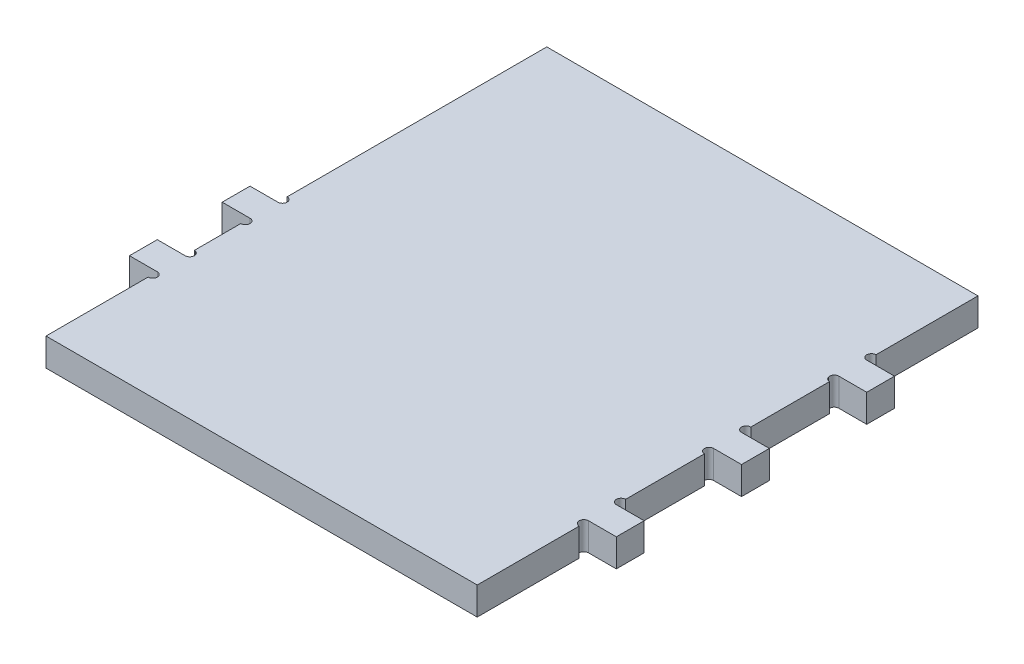
ISO-10303-21;
HEADER;
FILE_DESCRIPTION(('STEP AP214'),'2;1');
FILE_NAME('part.step','',(''),(''),'','','');
FILE_SCHEMA(('AUTOMOTIVE_DESIGN { 1 0 10303 214 1 1 1 1 }'));
ENDSEC;
DATA;
#1=APPLICATION_CONTEXT('core data for automotive mechanical design processes');
#2=APPLICATION_PROTOCOL_DEFINITION('international standard','automotive_design',2000,#1);
#3=PRODUCT_CONTEXT('',#1,'mechanical');
#4=PRODUCT('Part','Part','',(#3));
#5=PRODUCT_RELATED_PRODUCT_CATEGORY('part','',(#4));
#6=PRODUCT_DEFINITION_FORMATION('','',#4);
#7=PRODUCT_DEFINITION_CONTEXT('part definition',#1,'design');
#8=PRODUCT_DEFINITION('design','',#6,#7);
#9=PRODUCT_DEFINITION_SHAPE('','',#8);
#10=(LENGTH_UNIT() NAMED_UNIT(*) SI_UNIT(.MILLI.,.METRE.));
#11=(NAMED_UNIT(*) PLANE_ANGLE_UNIT() SI_UNIT($,.RADIAN.));
#12=(NAMED_UNIT(*) SI_UNIT($,.STERADIAN.) SOLID_ANGLE_UNIT());
#13=UNCERTAINTY_MEASURE_WITH_UNIT(LENGTH_MEASURE(1.E-05),#10,'distance_accuracy_value','');
#14=(GEOMETRIC_REPRESENTATION_CONTEXT(3) GLOBAL_UNCERTAINTY_ASSIGNED_CONTEXT((#13)) GLOBAL_UNIT_ASSIGNED_CONTEXT((#10,
#11,#12)) REPRESENTATION_CONTEXT('',''));
#15=CARTESIAN_POINT('',(0.,0.,0.));
#16=DIRECTION('',(0.,0.,1.));
#17=DIRECTION('',(1.,0.,0.));
#18=AXIS2_PLACEMENT_3D('',#15,#16,#17);
#19=CARTESIAN_POINT('',(0.,19.05,0.));
#20=DIRECTION('',(1.,0.,0.));
#21=DIRECTION('',(0.,0.,-1.));
#22=AXIS2_PLACEMENT_3D('',#19,#20,#21);
#23=PLANE('',#22);
#24=DIRECTION('',(0.,0.,1.));
#25=VECTOR('',#24,1.);
#26=CARTESIAN_POINT('',(0.,19.05,0.));
#27=LINE('',#26,#25);
#28=CARTESIAN_POINT('',(0.,19.05,-69.85));
#29=VERTEX_POINT('',#28);
#30=CARTESIAN_POINT('',(0.,19.05,0.));
#31=VERTEX_POINT('',#30);
#32=EDGE_CURVE('E451',#29,#31,#27,.T.);
#33=ORIENTED_EDGE('',*,*,#32,.F.);
#34=DIRECTION('',(0.,1.,0.));
#35=VECTOR('',#34,1.);
#36=CARTESIAN_POINT('',(0.,0.,-69.85));
#37=LINE('',#36,#35);
#38=CARTESIAN_POINT('',(0.,0.,-69.85));
#39=VERTEX_POINT('',#38);
#40=EDGE_CURVE('E585',#39,#29,#37,.T.);
#41=ORIENTED_EDGE('',*,*,#40,.F.);
#42=DIRECTION('',(0.,0.,1.));
#43=VECTOR('',#42,1.);
#44=CARTESIAN_POINT('',(0.,0.,0.));
#45=LINE('',#44,#43);
#46=CARTESIAN_POINT('',(0.,0.,0.));
#47=VERTEX_POINT('',#46);
#48=EDGE_CURVE('E368',#39,#47,#45,.T.);
#49=ORIENTED_EDGE('',*,*,#48,.T.);
#50=DIRECTION('',(0.,-1.,0.));
#51=VECTOR('',#50,1.);
#52=CARTESIAN_POINT('',(0.,19.05,0.));
#53=LINE('',#52,#51);
#54=EDGE_CURVE('E11',#31,#47,#53,.T.);
#55=ORIENTED_EDGE('',*,*,#54,.F.);
#56=EDGE_LOOP('',(#33,#41,#49,#55));
#57=FACE_BOUND('',#56,.T.);
#58=ADVANCED_FACE('F47',(#57),#23,.F.);
#59=CARTESIAN_POINT('',(0.,19.05,0.));
#60=DIRECTION('',(0.,0.,-1.));
#61=DIRECTION('',(-1.,0.,0.));
#62=AXIS2_PLACEMENT_3D('',#59,#60,#61);
#63=PLANE('',#62);
#64=DIRECTION('',(1.,0.,0.));
#65=VECTOR('',#64,1.);
#66=CARTESIAN_POINT('',(0.,0.,0.));
#67=LINE('',#66,#65);
#68=CARTESIAN_POINT('',(295.275,0.,0.));
#69=VERTEX_POINT('',#68);
#70=EDGE_CURVE('E371',#47,#69,#67,.T.);
#71=ORIENTED_EDGE('',*,*,#70,.T.);
#72=DIRECTION('',(0.,-1.,0.));
#73=VECTOR('',#72,1.);
#74=CARTESIAN_POINT('',(295.275,19.05,0.));
#75=LINE('',#74,#73);
#76=CARTESIAN_POINT('',(295.275,19.05,0.));
#77=VERTEX_POINT('',#76);
#78=EDGE_CURVE('E55',#77,#69,#75,.T.);
#79=ORIENTED_EDGE('',*,*,#78,.F.);
#80=DIRECTION('',(1.,0.,0.));
#81=VECTOR('',#80,1.);
#82=CARTESIAN_POINT('',(0.,19.05,0.));
#83=LINE('',#82,#81);
#84=EDGE_CURVE('E298',#31,#77,#83,.T.);
#85=ORIENTED_EDGE('',*,*,#84,.F.);
#86=ORIENTED_EDGE('',*,*,#54,.T.);
#87=EDGE_LOOP('',(#71,#79,#85,#86));
#88=FACE_BOUND('',#87,.T.);
#89=ADVANCED_FACE('F640',(#88),#63,.F.);
#90=CARTESIAN_POINT('',(295.275,19.05,0.));
#91=DIRECTION('',(-1.,0.,0.));
#92=DIRECTION('',(0.,0.,1.));
#93=AXIS2_PLACEMENT_3D('',#90,#91,#92);
#94=PLANE('',#93);
#95=DIRECTION('',(0.,0.,-1.));
#96=VECTOR('',#95,1.);
#97=CARTESIAN_POINT('',(295.275,0.,0.));
#98=LINE('',#97,#96);
#99=CARTESIAN_POINT('',(295.275,0.,-69.85));
#100=VERTEX_POINT('',#99);
#101=EDGE_CURVE('E375',#69,#100,#98,.T.);
#102=ORIENTED_EDGE('',*,*,#101,.T.);
#103=DIRECTION('',(0.,1.,0.));
#104=VECTOR('',#103,1.);
#105=CARTESIAN_POINT('',(295.275,0.,-69.85));
#106=LINE('',#105,#104);
#107=CARTESIAN_POINT('',(295.275,19.05,-69.85));
#108=VERTEX_POINT('',#107);
#109=EDGE_CURVE('E62',#100,#108,#106,.T.);
#110=ORIENTED_EDGE('',*,*,#109,.T.);
#111=DIRECTION('',(0.,0.,-1.));
#112=VECTOR('',#111,1.);
#113=CARTESIAN_POINT('',(295.275,19.05,0.));
#114=LINE('',#113,#112);
#115=EDGE_CURVE('E284',#77,#108,#114,.T.);
#116=ORIENTED_EDGE('',*,*,#115,.F.);
#117=ORIENTED_EDGE('',*,*,#78,.T.);
#118=EDGE_LOOP('',(#102,#110,#116,#117));
#119=FACE_BOUND('',#118,.T.);
#120=ADVANCED_FACE('F532',(#119),#94,.F.);
#121=CARTESIAN_POINT('',(295.275,19.05,-76.2));
#122=DIRECTION('',(0.,0.,-1.));
#123=DIRECTION('',(-1.,0.,0.));
#124=AXIS2_PLACEMENT_3D('',#121,#122,#123);
#125=PLANE('',#124);
#126=DIRECTION('',(1.,0.,0.));
#127=VECTOR('',#126,1.);
#128=CARTESIAN_POINT('',(295.275,0.,-76.2));
#129=LINE('',#128,#127);
#130=CARTESIAN_POINT('',(295.275,0.,-76.2));
#131=VERTEX_POINT('',#130);
#132=CARTESIAN_POINT('',(314.325,0.,-76.2));
#133=VERTEX_POINT('',#132);
#134=EDGE_CURVE('E379',#131,#133,#129,.T.);
#135=ORIENTED_EDGE('',*,*,#134,.T.);
#136=DIRECTION('',(0.,-1.,0.));
#137=VECTOR('',#136,1.);
#138=CARTESIAN_POINT('',(314.325,19.05,-76.2));
#139=LINE('',#138,#137);
#140=CARTESIAN_POINT('',(314.325,19.05,-76.2));
#141=VERTEX_POINT('',#140);
#142=EDGE_CURVE('E275',#141,#133,#139,.T.);
#143=ORIENTED_EDGE('',*,*,#142,.F.);
#144=DIRECTION('',(1.,0.,0.));
#145=VECTOR('',#144,1.);
#146=CARTESIAN_POINT('',(295.275,19.05,-76.2));
#147=LINE('',#146,#145);
#148=CARTESIAN_POINT('',(295.275,19.05,-76.2));
#149=VERTEX_POINT('',#148);
#150=EDGE_CURVE('E281',#149,#141,#147,.T.);
#151=ORIENTED_EDGE('',*,*,#150,.F.);
#152=DIRECTION('',(0.,-1.,0.));
#153=VECTOR('',#152,1.);
#154=CARTESIAN_POINT('',(295.275,19.05,-76.2));
#155=LINE('',#154,#153);
#156=EDGE_CURVE('E266',#149,#131,#155,.T.);
#157=ORIENTED_EDGE('',*,*,#156,.T.);
#158=EDGE_LOOP('',(#135,#143,#151,#157));
#159=FACE_BOUND('',#158,.T.);
#160=ADVANCED_FACE('F288',(#159),#125,.F.);
#161=CARTESIAN_POINT('',(314.325,19.05,-95.25));
#162=DIRECTION('',(-1.,0.,0.));
#163=DIRECTION('',(0.,0.,1.));
#164=AXIS2_PLACEMENT_3D('',#161,#162,#163);
#165=PLANE('',#164);
#166=DIRECTION('',(0.,0.,-1.));
#167=VECTOR('',#166,1.);
#168=CARTESIAN_POINT('',(314.325,0.,-95.25));
#169=LINE('',#168,#167);
#170=CARTESIAN_POINT('',(314.325,0.,-95.25));
#171=VERTEX_POINT('',#170);
#172=EDGE_CURVE('E382',#133,#171,#169,.T.);
#173=ORIENTED_EDGE('',*,*,#172,.T.);
#174=DIRECTION('',(0.,-1.,0.));
#175=VECTOR('',#174,1.);
#176=CARTESIAN_POINT('',(314.325,19.05,-95.25));
#177=LINE('',#176,#175);
#178=CARTESIAN_POINT('',(314.325,19.05,-95.25));
#179=VERTEX_POINT('',#178);
#180=EDGE_CURVE('E522',#179,#171,#177,.T.);
#181=ORIENTED_EDGE('',*,*,#180,.F.);
#182=DIRECTION('',(0.,0.,-1.));
#183=VECTOR('',#182,1.);
#184=CARTESIAN_POINT('',(314.325,19.05,-95.25));
#185=LINE('',#184,#183);
#186=EDGE_CURVE('E292',#141,#179,#185,.T.);
#187=ORIENTED_EDGE('',*,*,#186,.F.);
#188=ORIENTED_EDGE('',*,*,#142,.T.);
#189=EDGE_LOOP('',(#173,#181,#187,#188));
#190=FACE_BOUND('',#189,.T.);
#191=ADVANCED_FACE('F759',(#190),#165,.F.);
#192=CARTESIAN_POINT('',(295.275,19.05,-95.25));
#193=DIRECTION('',(0.,0.,1.));
#194=DIRECTION('',(1.,0.,0.));
#195=AXIS2_PLACEMENT_3D('',#192,#193,#194);
#196=PLANE('',#195);
#197=DIRECTION('',(-1.,0.,0.));
#198=VECTOR('',#197,1.);
#199=CARTESIAN_POINT('',(295.275,0.,-95.25));
#200=LINE('',#199,#198);
#201=CARTESIAN_POINT('',(295.275,0.,-95.25));
#202=VERTEX_POINT('',#201);
#203=EDGE_CURVE('E385',#171,#202,#200,.T.);
#204=ORIENTED_EDGE('',*,*,#203,.T.);
#205=DIRECTION('',(0.,-1.,0.));
#206=VECTOR('',#205,1.);
#207=CARTESIAN_POINT('',(295.275,19.05,-95.25));
#208=LINE('',#207,#206);
#209=CARTESIAN_POINT('',(295.275,19.05,-95.25));
#210=VERTEX_POINT('',#209);
#211=EDGE_CURVE('E519',#210,#202,#208,.T.);
#212=ORIENTED_EDGE('',*,*,#211,.F.);
#213=DIRECTION('',(-1.,0.,0.));
#214=VECTOR('',#213,1.);
#215=CARTESIAN_POINT('',(295.275,19.05,-95.25));
#216=LINE('',#215,#214);
#217=EDGE_CURVE('E296',#179,#210,#216,.T.);
#218=ORIENTED_EDGE('',*,*,#217,.F.);
#219=ORIENTED_EDGE('',*,*,#180,.T.);
#220=EDGE_LOOP('',(#204,#212,#218,#219));
#221=FACE_BOUND('',#220,.T.);
#222=ADVANCED_FACE('F755',(#221),#196,.F.);
#223=CARTESIAN_POINT('',(295.275,19.05,-95.25));
#224=DIRECTION('',(-1.,0.,0.));
#225=DIRECTION('',(0.,0.,1.));
#226=AXIS2_PLACEMENT_3D('',#223,#224,#225);
#227=PLANE('',#226);
#228=DIRECTION('',(0.,0.,-1.));
#229=VECTOR('',#228,1.);
#230=CARTESIAN_POINT('',(295.275,19.05,-95.25));
#231=LINE('',#230,#229);
#232=CARTESIAN_POINT('',(295.275,19.05,-101.6));
#233=VERTEX_POINT('',#232);
#234=CARTESIAN_POINT('',(295.275,19.05,-155.575));
#235=VERTEX_POINT('',#234);
#236=EDGE_CURVE('E305',#233,#235,#231,.T.);
#237=ORIENTED_EDGE('',*,*,#236,.F.);
#238=DIRECTION('',(0.,1.,0.));
#239=VECTOR('',#238,1.);
#240=CARTESIAN_POINT('',(295.275,0.,-101.6));
#241=LINE('',#240,#239);
#242=CARTESIAN_POINT('',(295.275,0.,-101.6));
#243=VERTEX_POINT('',#242);
#244=EDGE_CURVE('E286',#243,#233,#241,.T.);
#245=ORIENTED_EDGE('',*,*,#244,.F.);
#246=DIRECTION('',(0.,0.,-1.));
#247=VECTOR('',#246,1.);
#248=CARTESIAN_POINT('',(295.275,0.,-95.25));
#249=LINE('',#248,#247);
#250=CARTESIAN_POINT('',(295.275,0.,-155.575));
#251=VERTEX_POINT('',#250);
#252=EDGE_CURVE('E389',#243,#251,#249,.T.);
#253=ORIENTED_EDGE('',*,*,#252,.T.);
#254=DIRECTION('',(0.,1.,0.));
#255=VECTOR('',#254,1.);
#256=CARTESIAN_POINT('',(295.275,0.,-155.575));
#257=LINE('',#256,#255);
#258=EDGE_CURVE('E70',#251,#235,#257,.T.);
#259=ORIENTED_EDGE('',*,*,#258,.T.);
#260=EDGE_LOOP('',(#237,#245,#253,#259));
#261=FACE_BOUND('',#260,.T.);
#262=ADVANCED_FACE('F750',(#261),#227,.F.);
#263=CARTESIAN_POINT('',(295.275,19.05,-161.925));
#264=DIRECTION('',(0.,0.,-1.));
#265=DIRECTION('',(-1.,0.,0.));
#266=AXIS2_PLACEMENT_3D('',#263,#264,#265);
#267=PLANE('',#266);
#268=DIRECTION('',(1.,0.,0.));
#269=VECTOR('',#268,1.);
#270=CARTESIAN_POINT('',(295.275,0.,-161.925));
#271=LINE('',#270,#269);
#272=CARTESIAN_POINT('',(295.275,0.,-161.925));
#273=VERTEX_POINT('',#272);
#274=CARTESIAN_POINT('',(314.325,0.,-161.925));
#275=VERTEX_POINT('',#274);
#276=EDGE_CURVE('E393',#273,#275,#271,.T.);
#277=ORIENTED_EDGE('',*,*,#276,.T.);
#278=DIRECTION('',(0.,-1.,0.));
#279=VECTOR('',#278,1.);
#280=CARTESIAN_POINT('',(314.325,19.05,-161.925));
#281=LINE('',#280,#279);
#282=CARTESIAN_POINT('',(314.325,19.05,-161.925));
#283=VERTEX_POINT('',#282);
#284=EDGE_CURVE('E511',#283,#275,#281,.T.);
#285=ORIENTED_EDGE('',*,*,#284,.F.);
#286=DIRECTION('',(1.,0.,0.));
#287=VECTOR('',#286,1.);
#288=CARTESIAN_POINT('',(295.275,19.05,-161.925));
#289=LINE('',#288,#287);
#290=CARTESIAN_POINT('',(295.275,19.05,-161.925));
#291=VERTEX_POINT('',#290);
#292=EDGE_CURVE('E309',#291,#283,#289,.T.);
#293=ORIENTED_EDGE('',*,*,#292,.F.);
#294=DIRECTION('',(0.,-1.,0.));
#295=VECTOR('',#294,1.);
#296=CARTESIAN_POINT('',(295.275,19.05,-161.925));
#297=LINE('',#296,#295);
#298=EDGE_CURVE('E515',#291,#273,#297,.T.);
#299=ORIENTED_EDGE('',*,*,#298,.T.);
#300=EDGE_LOOP('',(#277,#285,#293,#299));
#301=FACE_BOUND('',#300,.T.);
#302=ADVANCED_FACE('F743',(#301),#267,.F.);
#303=CARTESIAN_POINT('',(314.325,19.05,-180.975));
#304=DIRECTION('',(-1.,0.,0.));
#305=DIRECTION('',(0.,0.,1.));
#306=AXIS2_PLACEMENT_3D('',#303,#304,#305);
#307=PLANE('',#306);
#308=DIRECTION('',(0.,0.,-1.));
#309=VECTOR('',#308,1.);
#310=CARTESIAN_POINT('',(314.325,0.,-180.975));
#311=LINE('',#310,#309);
#312=CARTESIAN_POINT('',(314.325,0.,-180.975));
#313=VERTEX_POINT('',#312);
#314=EDGE_CURVE('E396',#275,#313,#311,.T.);
#315=ORIENTED_EDGE('',*,*,#314,.T.);
#316=DIRECTION('',(0.,-1.,0.));
#317=VECTOR('',#316,1.);
#318=CARTESIAN_POINT('',(314.325,19.05,-180.975));
#319=LINE('',#318,#317);
#320=CARTESIAN_POINT('',(314.325,19.05,-180.975));
#321=VERTEX_POINT('',#320);
#322=EDGE_CURVE('E507',#321,#313,#319,.T.);
#323=ORIENTED_EDGE('',*,*,#322,.F.);
#324=DIRECTION('',(0.,0.,-1.));
#325=VECTOR('',#324,1.);
#326=CARTESIAN_POINT('',(314.325,19.05,-180.975));
#327=LINE('',#326,#325);
#328=EDGE_CURVE('E312',#283,#321,#327,.T.);
#329=ORIENTED_EDGE('',*,*,#328,.F.);
#330=ORIENTED_EDGE('',*,*,#284,.T.);
#331=EDGE_LOOP('',(#315,#323,#329,#330));
#332=FACE_BOUND('',#331,.T.);
#333=ADVANCED_FACE('F739',(#332),#307,.F.);
#334=CARTESIAN_POINT('',(295.275,19.05,-180.975));
#335=DIRECTION('',(0.,0.,1.));
#336=DIRECTION('',(1.,0.,0.));
#337=AXIS2_PLACEMENT_3D('',#334,#335,#336);
#338=PLANE('',#337);
#339=DIRECTION('',(-1.,0.,0.));
#340=VECTOR('',#339,1.);
#341=CARTESIAN_POINT('',(295.275,0.,-180.975));
#342=LINE('',#341,#340);
#343=CARTESIAN_POINT('',(295.275,0.,-180.975));
#344=VERTEX_POINT('',#343);
#345=EDGE_CURVE('E399',#313,#344,#342,.T.);
#346=ORIENTED_EDGE('',*,*,#345,.T.);
#347=DIRECTION('',(0.,-1.,0.));
#348=VECTOR('',#347,1.);
#349=CARTESIAN_POINT('',(295.275,19.05,-180.975));
#350=LINE('',#349,#348);
#351=CARTESIAN_POINT('',(295.275,19.05,-180.975));
#352=VERTEX_POINT('',#351);
#353=EDGE_CURVE('E504',#352,#344,#350,.T.);
#354=ORIENTED_EDGE('',*,*,#353,.F.);
#355=DIRECTION('',(-1.,0.,0.));
#356=VECTOR('',#355,1.);
#357=CARTESIAN_POINT('',(295.275,19.05,-180.975));
#358=LINE('',#357,#356);
#359=EDGE_CURVE('E315',#321,#352,#358,.T.);
#360=ORIENTED_EDGE('',*,*,#359,.F.);
#361=ORIENTED_EDGE('',*,*,#322,.T.);
#362=EDGE_LOOP('',(#346,#354,#360,#361));
#363=FACE_BOUND('',#362,.T.);
#364=ADVANCED_FACE('F734',(#363),#338,.F.);
#365=CARTESIAN_POINT('',(295.275,19.05,-180.975));
#366=DIRECTION('',(-1.,0.,0.));
#367=DIRECTION('',(0.,0.,1.));
#368=AXIS2_PLACEMENT_3D('',#365,#366,#367);
#369=PLANE('',#368);
#370=DIRECTION('',(0.,0.,-1.));
#371=VECTOR('',#370,1.);
#372=CARTESIAN_POINT('',(295.275,19.05,-180.975));
#373=LINE('',#372,#371);
#374=CARTESIAN_POINT('',(295.275,19.05,-187.325));
#375=VERTEX_POINT('',#374);
#376=CARTESIAN_POINT('',(295.275,19.05,-241.3));
#377=VERTEX_POINT('',#376);
#378=EDGE_CURVE('E319',#375,#377,#373,.T.);
#379=ORIENTED_EDGE('',*,*,#378,.F.);
#380=DIRECTION('',(0.,1.,0.));
#381=VECTOR('',#380,1.);
#382=CARTESIAN_POINT('',(295.275,0.,-187.325));
#383=LINE('',#382,#381);
#384=CARTESIAN_POINT('',(295.275,0.,-187.325));
#385=VERTEX_POINT('',#384);
#386=EDGE_CURVE('E559',#385,#375,#383,.T.);
#387=ORIENTED_EDGE('',*,*,#386,.F.);
#388=DIRECTION('',(0.,0.,-1.));
#389=VECTOR('',#388,1.);
#390=CARTESIAN_POINT('',(295.275,0.,-180.975));
#391=LINE('',#390,#389);
#392=CARTESIAN_POINT('',(295.275,0.,-241.3));
#393=VERTEX_POINT('',#392);
#394=EDGE_CURVE('E403',#385,#393,#391,.T.);
#395=ORIENTED_EDGE('',*,*,#394,.T.);
#396=DIRECTION('',(0.,1.,0.));
#397=VECTOR('',#396,1.);
#398=CARTESIAN_POINT('',(295.275,0.,-241.3));
#399=LINE('',#398,#397);
#400=EDGE_CURVE('E546',#393,#377,#399,.T.);
#401=ORIENTED_EDGE('',*,*,#400,.T.);
#402=EDGE_LOOP('',(#379,#387,#395,#401));
#403=FACE_BOUND('',#402,.T.);
#404=ADVANCED_FACE('F727',(#403),#369,.F.);
#405=CARTESIAN_POINT('',(295.275,19.05,-247.65));
#406=DIRECTION('',(0.,0.,-1.));
#407=DIRECTION('',(-1.,0.,0.));
#408=AXIS2_PLACEMENT_3D('',#405,#406,#407);
#409=PLANE('',#408);
#410=DIRECTION('',(1.,0.,0.));
#411=VECTOR('',#410,1.);
#412=CARTESIAN_POINT('',(295.275,0.,-247.65));
#413=LINE('',#412,#411);
#414=CARTESIAN_POINT('',(295.275,0.,-247.65));
#415=VERTEX_POINT('',#414);
#416=CARTESIAN_POINT('',(314.325,0.,-247.65));
#417=VERTEX_POINT('',#416);
#418=EDGE_CURVE('E407',#415,#417,#413,.T.);
#419=ORIENTED_EDGE('',*,*,#418,.T.);
#420=DIRECTION('',(0.,-1.,0.));
#421=VECTOR('',#420,1.);
#422=CARTESIAN_POINT('',(314.325,19.05,-247.65));
#423=LINE('',#422,#421);
#424=CARTESIAN_POINT('',(314.325,19.05,-247.65));
#425=VERTEX_POINT('',#424);
#426=EDGE_CURVE('E496',#425,#417,#423,.T.);
#427=ORIENTED_EDGE('',*,*,#426,.F.);
#428=DIRECTION('',(1.,0.,0.));
#429=VECTOR('',#428,1.);
#430=CARTESIAN_POINT('',(295.275,19.05,-247.65));
#431=LINE('',#430,#429);
#432=CARTESIAN_POINT('',(295.275,19.05,-247.65));
#433=VERTEX_POINT('',#432);
#434=EDGE_CURVE('E323',#433,#425,#431,.T.);
#435=ORIENTED_EDGE('',*,*,#434,.F.);
#436=DIRECTION('',(0.,-1.,0.));
#437=VECTOR('',#436,1.);
#438=CARTESIAN_POINT('',(295.275,19.05,-247.65));
#439=LINE('',#438,#437);
#440=EDGE_CURVE('E500',#433,#415,#439,.T.);
#441=ORIENTED_EDGE('',*,*,#440,.T.);
#442=EDGE_LOOP('',(#419,#427,#435,#441));
#443=FACE_BOUND('',#442,.T.);
#444=ADVANCED_FACE('F719',(#443),#409,.F.);
#445=CARTESIAN_POINT('',(314.325,19.05,-266.7));
#446=DIRECTION('',(-1.,0.,0.));
#447=DIRECTION('',(0.,0.,1.));
#448=AXIS2_PLACEMENT_3D('',#445,#446,#447);
#449=PLANE('',#448);
#450=DIRECTION('',(0.,0.,-1.));
#451=VECTOR('',#450,1.);
#452=CARTESIAN_POINT('',(314.325,0.,-266.7));
#453=LINE('',#452,#451);
#454=CARTESIAN_POINT('',(314.325,0.,-266.7));
#455=VERTEX_POINT('',#454);
#456=EDGE_CURVE('E410',#417,#455,#453,.T.);
#457=ORIENTED_EDGE('',*,*,#456,.T.);
#458=DIRECTION('',(0.,-1.,0.));
#459=VECTOR('',#458,1.);
#460=CARTESIAN_POINT('',(314.325,19.05,-266.7));
#461=LINE('',#460,#459);
#462=CARTESIAN_POINT('',(314.325,19.05,-266.7));
#463=VERTEX_POINT('',#462);
#464=EDGE_CURVE('E492',#463,#455,#461,.T.);
#465=ORIENTED_EDGE('',*,*,#464,.F.);
#466=DIRECTION('',(0.,0.,-1.));
#467=VECTOR('',#466,1.);
#468=CARTESIAN_POINT('',(314.325,19.05,-266.7));
#469=LINE('',#468,#467);
#470=EDGE_CURVE('E326',#425,#463,#469,.T.);
#471=ORIENTED_EDGE('',*,*,#470,.F.);
#472=ORIENTED_EDGE('',*,*,#426,.T.);
#473=EDGE_LOOP('',(#457,#465,#471,#472));
#474=FACE_BOUND('',#473,.T.);
#475=ADVANCED_FACE('F715',(#474),#449,.F.);
#476=CARTESIAN_POINT('',(295.275,19.05,-266.7));
#477=DIRECTION('',(0.,0.,1.));
#478=DIRECTION('',(1.,0.,0.));
#479=AXIS2_PLACEMENT_3D('',#476,#477,#478);
#480=PLANE('',#479);
#481=DIRECTION('',(-1.,0.,0.));
#482=VECTOR('',#481,1.);
#483=CARTESIAN_POINT('',(295.275,0.,-266.7));
#484=LINE('',#483,#482);
#485=CARTESIAN_POINT('',(295.275,0.,-266.7));
#486=VERTEX_POINT('',#485);
#487=EDGE_CURVE('E413',#455,#486,#484,.T.);
#488=ORIENTED_EDGE('',*,*,#487,.T.);
#489=DIRECTION('',(0.,-1.,0.));
#490=VECTOR('',#489,1.);
#491=CARTESIAN_POINT('',(295.275,19.05,-266.7));
#492=LINE('',#491,#490);
#493=CARTESIAN_POINT('',(295.275,19.05,-266.7));
#494=VERTEX_POINT('',#493);
#495=EDGE_CURVE('E489',#494,#486,#492,.T.);
#496=ORIENTED_EDGE('',*,*,#495,.F.);
#497=DIRECTION('',(-1.,0.,0.));
#498=VECTOR('',#497,1.);
#499=CARTESIAN_POINT('',(295.275,19.05,-266.7));
#500=LINE('',#499,#498);
#501=EDGE_CURVE('E329',#463,#494,#500,.T.);
#502=ORIENTED_EDGE('',*,*,#501,.F.);
#503=ORIENTED_EDGE('',*,*,#464,.T.);
#504=EDGE_LOOP('',(#488,#496,#502,#503));
#505=FACE_BOUND('',#504,.T.);
#506=ADVANCED_FACE('F710',(#505),#480,.F.);
#507=CARTESIAN_POINT('',(295.275,19.05,-266.7));
#508=DIRECTION('',(-1.,0.,0.));
#509=DIRECTION('',(0.,0.,1.));
#510=AXIS2_PLACEMENT_3D('',#507,#508,#509);
#511=PLANE('',#510);
#512=DIRECTION('',(0.,0.,-1.));
#513=VECTOR('',#512,1.);
#514=CARTESIAN_POINT('',(295.275,19.05,-266.7));
#515=LINE('',#514,#513);
#516=CARTESIAN_POINT('',(295.275,19.05,-273.05));
#517=VERTEX_POINT('',#516);
#518=CARTESIAN_POINT('',(295.275,19.05,-342.9));
#519=VERTEX_POINT('',#518);
#520=EDGE_CURVE('E333',#517,#519,#515,.T.);
#521=ORIENTED_EDGE('',*,*,#520,.F.);
#522=DIRECTION('',(0.,1.,0.));
#523=VECTOR('',#522,1.);
#524=CARTESIAN_POINT('',(295.275,0.,-273.05));
#525=LINE('',#524,#523);
#526=CARTESIAN_POINT('',(295.275,0.,-273.05));
#527=VERTEX_POINT('',#526);
#528=EDGE_CURVE('E555',#527,#517,#525,.T.);
#529=ORIENTED_EDGE('',*,*,#528,.F.);
#530=DIRECTION('',(0.,0.,-1.));
#531=VECTOR('',#530,1.);
#532=CARTESIAN_POINT('',(295.275,0.,-266.7));
#533=LINE('',#532,#531);
#534=CARTESIAN_POINT('',(295.275,0.,-342.9));
#535=VERTEX_POINT('',#534);
#536=EDGE_CURVE('E417',#527,#535,#533,.T.);
#537=ORIENTED_EDGE('',*,*,#536,.T.);
#538=DIRECTION('',(0.,-1.,0.));
#539=VECTOR('',#538,1.);
#540=CARTESIAN_POINT('',(295.275,19.05,-342.9));
#541=LINE('',#540,#539);
#542=EDGE_CURVE('E485',#519,#535,#541,.T.);
#543=ORIENTED_EDGE('',*,*,#542,.F.);
#544=EDGE_LOOP('',(#521,#529,#537,#543));
#545=FACE_BOUND('',#544,.T.);
#546=ADVANCED_FACE('F700',(#545),#511,.F.);
#547=CARTESIAN_POINT('',(0.,19.05,-342.9));
#548=DIRECTION('',(0.,0.,1.));
#549=DIRECTION('',(1.,0.,0.));
#550=AXIS2_PLACEMENT_3D('',#547,#548,#549);
#551=PLANE('',#550);
#552=DIRECTION('',(-1.,0.,0.));
#553=VECTOR('',#552,1.);
#554=CARTESIAN_POINT('',(0.,0.,-342.9));
#555=LINE('',#554,#553);
#556=CARTESIAN_POINT('',(0.,0.,-342.9));
#557=VERTEX_POINT('',#556);
#558=EDGE_CURVE('E420',#535,#557,#555,.T.);
#559=ORIENTED_EDGE('',*,*,#558,.T.);
#560=DIRECTION('',(0.,-1.,0.));
#561=VECTOR('',#560,1.);
#562=CARTESIAN_POINT('',(0.,19.05,-342.9));
#563=LINE('',#562,#561);
#564=CARTESIAN_POINT('',(0.,19.05,-342.9));
#565=VERTEX_POINT('',#564);
#566=EDGE_CURVE('E481',#565,#557,#563,.T.);
#567=ORIENTED_EDGE('',*,*,#566,.F.);
#568=DIRECTION('',(-1.,0.,0.));
#569=VECTOR('',#568,1.);
#570=CARTESIAN_POINT('',(0.,19.05,-342.9));
#571=LINE('',#570,#569);
#572=EDGE_CURVE('E336',#519,#565,#571,.T.);
#573=ORIENTED_EDGE('',*,*,#572,.F.);
#574=ORIENTED_EDGE('',*,*,#542,.T.);
#575=EDGE_LOOP('',(#559,#567,#573,#574));
#576=FACE_BOUND('',#575,.T.);
#577=ADVANCED_FACE('F696',(#576),#551,.F.);
#578=CARTESIAN_POINT('',(0.,19.05,-158.75));
#579=DIRECTION('',(1.,0.,0.));
#580=DIRECTION('',(0.,0.,-1.));
#581=AXIS2_PLACEMENT_3D('',#578,#579,#580);
#582=PLANE('',#581);
#583=DIRECTION('',(0.,0.,1.));
#584=VECTOR('',#583,1.);
#585=CARTESIAN_POINT('',(0.,0.,-158.75));
#586=LINE('',#585,#584);
#587=CARTESIAN_POINT('',(0.,0.,-165.1));
#588=VERTEX_POINT('',#587);
#589=EDGE_CURVE('E423',#557,#588,#586,.T.);
#590=ORIENTED_EDGE('',*,*,#589,.T.);
#591=DIRECTION('',(0.,1.,0.));
#592=VECTOR('',#591,1.);
#593=CARTESIAN_POINT('',(0.,0.,-165.1));
#594=LINE('',#593,#592);
#595=CARTESIAN_POINT('',(0.,19.05,-165.1));
#596=VERTEX_POINT('',#595);
#597=EDGE_CURVE('E372',#588,#596,#594,.T.);
#598=ORIENTED_EDGE('',*,*,#597,.T.);
#599=DIRECTION('',(0.,0.,1.));
#600=VECTOR('',#599,1.);
#601=CARTESIAN_POINT('',(0.,19.05,-158.75));
#602=LINE('',#601,#600);
#603=EDGE_CURVE('E339',#565,#596,#602,.T.);
#604=ORIENTED_EDGE('',*,*,#603,.F.);
#605=ORIENTED_EDGE('',*,*,#566,.T.);
#606=EDGE_LOOP('',(#590,#598,#604,#605));
#607=FACE_BOUND('',#606,.T.);
#608=ADVANCED_FACE('F692',(#607),#582,.F.);
#609=CARTESIAN_POINT('',(0.,19.05,-158.75));
#610=DIRECTION('',(0.,0.,1.));
#611=DIRECTION('',(1.,0.,0.));
#612=AXIS2_PLACEMENT_3D('',#609,#610,#611);
#613=PLANE('',#612);
#614=DIRECTION('',(-1.,0.,0.));
#615=VECTOR('',#614,1.);
#616=CARTESIAN_POINT('',(0.,0.,-158.75));
#617=LINE('',#616,#615);
#618=CARTESIAN_POINT('',(0.,0.,-158.75));
#619=VERTEX_POINT('',#618);
#620=CARTESIAN_POINT('',(-19.05,0.,-158.75));
#621=VERTEX_POINT('',#620);
#622=EDGE_CURVE('E427',#619,#621,#617,.T.);
#623=ORIENTED_EDGE('',*,*,#622,.T.);
#624=DIRECTION('',(0.,-1.,0.));
#625=VECTOR('',#624,1.);
#626=CARTESIAN_POINT('',(-19.05,19.05,-158.75));
#627=LINE('',#626,#625);
#628=CARTESIAN_POINT('',(-19.05,19.05,-158.75));
#629=VERTEX_POINT('',#628);
#630=EDGE_CURVE('E473',#629,#621,#627,.T.);
#631=ORIENTED_EDGE('',*,*,#630,.F.);
#632=DIRECTION('',(-1.,0.,0.));
#633=VECTOR('',#632,1.);
#634=CARTESIAN_POINT('',(0.,19.05,-158.75));
#635=LINE('',#634,#633);
#636=CARTESIAN_POINT('',(0.,19.05,-158.75));
#637=VERTEX_POINT('',#636);
#638=EDGE_CURVE('E343',#637,#629,#635,.T.);
#639=ORIENTED_EDGE('',*,*,#638,.F.);
#640=DIRECTION('',(0.,-1.,0.));
#641=VECTOR('',#640,1.);
#642=CARTESIAN_POINT('',(0.,19.05,-158.75));
#643=LINE('',#642,#641);
#644=EDGE_CURVE('E477',#637,#619,#643,.T.);
#645=ORIENTED_EDGE('',*,*,#644,.T.);
#646=EDGE_LOOP('',(#623,#631,#639,#645));
#647=FACE_BOUND('',#646,.T.);
#648=ADVANCED_FACE('F683',(#647),#613,.F.);
#649=CARTESIAN_POINT('',(-19.05,19.05,-139.7));
#650=DIRECTION('',(1.,0.,0.));
#651=DIRECTION('',(0.,0.,-1.));
#652=AXIS2_PLACEMENT_3D('',#649,#650,#651);
#653=PLANE('',#652);
#654=DIRECTION('',(0.,0.,1.));
#655=VECTOR('',#654,1.);
#656=CARTESIAN_POINT('',(-19.05,0.,-139.7));
#657=LINE('',#656,#655);
#658=CARTESIAN_POINT('',(-19.05,0.,-139.7));
#659=VERTEX_POINT('',#658);
#660=EDGE_CURVE('E430',#621,#659,#657,.T.);
#661=ORIENTED_EDGE('',*,*,#660,.T.);
#662=DIRECTION('',(0.,-1.,0.));
#663=VECTOR('',#662,1.);
#664=CARTESIAN_POINT('',(-19.05,19.05,-139.7));
#665=LINE('',#664,#663);
#666=CARTESIAN_POINT('',(-19.05,19.05,-139.7));
#667=VERTEX_POINT('',#666);
#668=EDGE_CURVE('E469',#667,#659,#665,.T.);
#669=ORIENTED_EDGE('',*,*,#668,.F.);
#670=DIRECTION('',(0.,0.,1.));
#671=VECTOR('',#670,1.);
#672=CARTESIAN_POINT('',(-19.05,19.05,-139.7));
#673=LINE('',#672,#671);
#674=EDGE_CURVE('E346',#629,#667,#673,.T.);
#675=ORIENTED_EDGE('',*,*,#674,.F.);
#676=ORIENTED_EDGE('',*,*,#630,.T.);
#677=EDGE_LOOP('',(#661,#669,#675,#676));
#678=FACE_BOUND('',#677,.T.);
#679=ADVANCED_FACE('F678',(#678),#653,.F.);
#680=CARTESIAN_POINT('',(0.,19.05,-139.7));
#681=DIRECTION('',(0.,0.,-1.));
#682=DIRECTION('',(-1.,0.,0.));
#683=AXIS2_PLACEMENT_3D('',#680,#681,#682);
#684=PLANE('',#683);
#685=DIRECTION('',(1.,0.,0.));
#686=VECTOR('',#685,1.);
#687=CARTESIAN_POINT('',(0.,0.,-139.7));
#688=LINE('',#687,#686);
#689=CARTESIAN_POINT('',(0.,0.,-139.7));
#690=VERTEX_POINT('',#689);
#691=EDGE_CURVE('E433',#659,#690,#688,.T.);
#692=ORIENTED_EDGE('',*,*,#691,.T.);
#693=DIRECTION('',(0.,-1.,0.));
#694=VECTOR('',#693,1.);
#695=CARTESIAN_POINT('',(0.,19.05,-139.7));
#696=LINE('',#695,#694);
#697=CARTESIAN_POINT('',(0.,19.05,-139.7));
#698=VERTEX_POINT('',#697);
#699=EDGE_CURVE('E466',#698,#690,#696,.T.);
#700=ORIENTED_EDGE('',*,*,#699,.F.);
#701=DIRECTION('',(1.,0.,0.));
#702=VECTOR('',#701,1.);
#703=CARTESIAN_POINT('',(0.,19.05,-139.7));
#704=LINE('',#703,#702);
#705=EDGE_CURVE('E349',#667,#698,#704,.T.);
#706=ORIENTED_EDGE('',*,*,#705,.F.);
#707=ORIENTED_EDGE('',*,*,#668,.T.);
#708=EDGE_LOOP('',(#692,#700,#706,#707));
#709=FACE_BOUND('',#708,.T.);
#710=ADVANCED_FACE('F673',(#709),#684,.F.);
#711=CARTESIAN_POINT('',(0.,19.05,-95.25));
#712=DIRECTION('',(1.,0.,0.));
#713=DIRECTION('',(0.,0.,-1.));
#714=AXIS2_PLACEMENT_3D('',#711,#712,#713);
#715=PLANE('',#714);
#716=DIRECTION('',(0.,0.,1.));
#717=VECTOR('',#716,1.);
#718=CARTESIAN_POINT('',(0.,19.05,-95.25));
#719=LINE('',#718,#717);
#720=CARTESIAN_POINT('',(0.,19.05,-133.35));
#721=VERTEX_POINT('',#720);
#722=CARTESIAN_POINT('',(0.,19.05,-101.6));
#723=VERTEX_POINT('',#722);
#724=EDGE_CURVE('E353',#721,#723,#719,.T.);
#725=ORIENTED_EDGE('',*,*,#724,.F.);
#726=DIRECTION('',(0.,1.,0.));
#727=VECTOR('',#726,1.);
#728=CARTESIAN_POINT('',(0.,0.,-133.35));
#729=LINE('',#728,#727);
#730=CARTESIAN_POINT('',(0.,0.,-133.35));
#731=VERTEX_POINT('',#730);
#732=EDGE_CURVE('E605',#731,#721,#729,.T.);
#733=ORIENTED_EDGE('',*,*,#732,.F.);
#734=DIRECTION('',(0.,0.,1.));
#735=VECTOR('',#734,1.);
#736=CARTESIAN_POINT('',(0.,0.,-95.25));
#737=LINE('',#736,#735);
#738=CARTESIAN_POINT('',(0.,0.,-101.6));
#739=VERTEX_POINT('',#738);
#740=EDGE_CURVE('E437',#731,#739,#737,.T.);
#741=ORIENTED_EDGE('',*,*,#740,.T.);
#742=DIRECTION('',(0.,1.,0.));
#743=VECTOR('',#742,1.);
#744=CARTESIAN_POINT('',(0.,0.,-101.6));
#745=LINE('',#744,#743);
#746=EDGE_CURVE('E593',#739,#723,#745,.T.);
#747=ORIENTED_EDGE('',*,*,#746,.T.);
#748=EDGE_LOOP('',(#725,#733,#741,#747));
#749=FACE_BOUND('',#748,.T.);
#750=ADVANCED_FACE('F667',(#749),#715,.F.);
#751=CARTESIAN_POINT('',(0.,19.05,-95.25));
#752=DIRECTION('',(0.,0.,1.));
#753=DIRECTION('',(1.,0.,0.));
#754=AXIS2_PLACEMENT_3D('',#751,#752,#753);
#755=PLANE('',#754);
#756=DIRECTION('',(-1.,0.,0.));
#757=VECTOR('',#756,1.);
#758=CARTESIAN_POINT('',(0.,0.,-95.25));
#759=LINE('',#758,#757);
#760=CARTESIAN_POINT('',(0.,0.,-95.25));
#761=VERTEX_POINT('',#760);
#762=CARTESIAN_POINT('',(-19.05,0.,-95.25));
#763=VERTEX_POINT('',#762);
#764=EDGE_CURVE('E441',#761,#763,#759,.T.);
#765=ORIENTED_EDGE('',*,*,#764,.T.);
#766=DIRECTION('',(0.,-1.,0.));
#767=VECTOR('',#766,1.);
#768=CARTESIAN_POINT('',(-19.05,19.05,-95.25));
#769=LINE('',#768,#767);
#770=CARTESIAN_POINT('',(-19.05,19.05,-95.25));
#771=VERTEX_POINT('',#770);
#772=EDGE_CURVE('E458',#771,#763,#769,.T.);
#773=ORIENTED_EDGE('',*,*,#772,.F.);
#774=DIRECTION('',(-1.,0.,0.));
#775=VECTOR('',#774,1.);
#776=CARTESIAN_POINT('',(0.,19.05,-95.25));
#777=LINE('',#776,#775);
#778=CARTESIAN_POINT('',(0.,19.05,-95.25));
#779=VERTEX_POINT('',#778);
#780=EDGE_CURVE('E357',#779,#771,#777,.T.);
#781=ORIENTED_EDGE('',*,*,#780,.F.);
#782=DIRECTION('',(0.,-1.,0.));
#783=VECTOR('',#782,1.);
#784=CARTESIAN_POINT('',(0.,19.05,-95.25));
#785=LINE('',#784,#783);
#786=EDGE_CURVE('E462',#779,#761,#785,.T.);
#787=ORIENTED_EDGE('',*,*,#786,.T.);
#788=EDGE_LOOP('',(#765,#773,#781,#787));
#789=FACE_BOUND('',#788,.T.);
#790=ADVANCED_FACE('F658',(#789),#755,.F.);
#791=CARTESIAN_POINT('',(-19.05,19.05,-76.2));
#792=DIRECTION('',(1.,0.,0.));
#793=DIRECTION('',(0.,0.,-1.));
#794=AXIS2_PLACEMENT_3D('',#791,#792,#793);
#795=PLANE('',#794);
#796=DIRECTION('',(0.,0.,1.));
#797=VECTOR('',#796,1.);
#798=CARTESIAN_POINT('',(-19.05,0.,-76.2));
#799=LINE('',#798,#797);
#800=CARTESIAN_POINT('',(-19.05,0.,-76.2));
#801=VERTEX_POINT('',#800);
#802=EDGE_CURVE('E444',#763,#801,#799,.T.);
#803=ORIENTED_EDGE('',*,*,#802,.T.);
#804=DIRECTION('',(0.,-1.,0.));
#805=VECTOR('',#804,1.);
#806=CARTESIAN_POINT('',(-19.05,19.05,-76.2));
#807=LINE('',#806,#805);
#808=CARTESIAN_POINT('',(-19.05,19.05,-76.2));
#809=VERTEX_POINT('',#808);
#810=EDGE_CURVE('E454',#809,#801,#807,.T.);
#811=ORIENTED_EDGE('',*,*,#810,.F.);
#812=DIRECTION('',(0.,0.,1.));
#813=VECTOR('',#812,1.);
#814=CARTESIAN_POINT('',(-19.05,19.05,-76.2));
#815=LINE('',#814,#813);
#816=EDGE_CURVE('E360',#771,#809,#815,.T.);
#817=ORIENTED_EDGE('',*,*,#816,.F.);
#818=ORIENTED_EDGE('',*,*,#772,.T.);
#819=EDGE_LOOP('',(#803,#811,#817,#818));
#820=FACE_BOUND('',#819,.T.);
#821=ADVANCED_FACE('F653',(#820),#795,.F.);
#822=CARTESIAN_POINT('',(0.,19.05,-76.2));
#823=DIRECTION('',(0.,0.,-1.));
#824=DIRECTION('',(-1.,0.,0.));
#825=AXIS2_PLACEMENT_3D('',#822,#823,#824);
#826=PLANE('',#825);
#827=DIRECTION('',(1.,0.,0.));
#828=VECTOR('',#827,1.);
#829=CARTESIAN_POINT('',(0.,0.,-76.2));
#830=LINE('',#829,#828);
#831=CARTESIAN_POINT('',(0.,0.,-76.2));
#832=VERTEX_POINT('',#831);
#833=EDGE_CURVE('E447',#801,#832,#830,.T.);
#834=ORIENTED_EDGE('',*,*,#833,.T.);
#835=DIRECTION('',(0.,-1.,0.));
#836=VECTOR('',#835,1.);
#837=CARTESIAN_POINT('',(0.,19.05,-76.2));
#838=LINE('',#837,#836);
#839=CARTESIAN_POINT('',(0.,19.05,-76.2));
#840=VERTEX_POINT('',#839);
#841=EDGE_CURVE('E367',#840,#832,#838,.T.);
#842=ORIENTED_EDGE('',*,*,#841,.F.);
#843=DIRECTION('',(1.,0.,0.));
#844=VECTOR('',#843,1.);
#845=CARTESIAN_POINT('',(0.,19.05,-76.2));
#846=LINE('',#845,#844);
#847=EDGE_CURVE('E363',#809,#840,#846,.T.);
#848=ORIENTED_EDGE('',*,*,#847,.F.);
#849=ORIENTED_EDGE('',*,*,#810,.T.);
#850=EDGE_LOOP('',(#834,#842,#848,#849));
#851=FACE_BOUND('',#850,.T.);
#852=ADVANCED_FACE('F648',(#851),#826,.F.);
#853=CARTESIAN_POINT('',(0.,19.05,0.));
#854=DIRECTION('',(0.,1.,0.));
#855=DIRECTION('',(0.,0.,1.));
#856=AXIS2_PLACEMENT_3D('',#853,#854,#855);
#857=PLANE('',#856);
#858=CARTESIAN_POINT('',(295.275,19.05,-98.425));
#859=DIRECTION('',(0.,1.,0.));
#860=DIRECTION('',(0.,0.,-1.));
#861=AXIS2_PLACEMENT_3D('',#858,#859,#860);
#862=CIRCLE('',#861,3.17499999999998);
#863=EDGE_CURVE('E572',#233,#210,#862,.T.);
#864=ORIENTED_EDGE('',*,*,#863,.F.);
#865=ORIENTED_EDGE('',*,*,#236,.T.);
#866=CARTESIAN_POINT('',(295.275,19.05,-158.75));
#867=DIRECTION('',(0.,1.,0.));
#868=DIRECTION('',(0.,0.,1.));
#869=AXIS2_PLACEMENT_3D('',#866,#867,#868);
#870=CIRCLE('',#869,3.17499999999998);
#871=EDGE_CURVE('E563',#291,#235,#870,.T.);
#872=ORIENTED_EDGE('',*,*,#871,.F.);
#873=ORIENTED_EDGE('',*,*,#292,.T.);
#874=ORIENTED_EDGE('',*,*,#328,.T.);
#875=ORIENTED_EDGE('',*,*,#359,.T.);
#876=CARTESIAN_POINT('',(295.275,19.05,-184.15));
#877=DIRECTION('',(0.,1.,0.));
#878=DIRECTION('',(0.,0.,-1.));
#879=AXIS2_PLACEMENT_3D('',#876,#877,#878);
#880=CIRCLE('',#879,3.17499999999998);
#881=EDGE_CURVE('E551',#375,#352,#880,.T.);
#882=ORIENTED_EDGE('',*,*,#881,.F.);
#883=ORIENTED_EDGE('',*,*,#378,.T.);
#884=CARTESIAN_POINT('',(295.275,19.05,-244.475));
#885=DIRECTION('',(0.,1.,0.));
#886=DIRECTION('',(0.,0.,1.));
#887=AXIS2_PLACEMENT_3D('',#884,#885,#886);
#888=CIRCLE('',#887,3.17499999999998);
#889=EDGE_CURVE('E552',#433,#377,#888,.T.);
#890=ORIENTED_EDGE('',*,*,#889,.F.);
#891=ORIENTED_EDGE('',*,*,#434,.T.);
#892=ORIENTED_EDGE('',*,*,#470,.T.);
#893=ORIENTED_EDGE('',*,*,#501,.T.);
#894=CARTESIAN_POINT('',(295.275,19.05,-269.875));
#895=DIRECTION('',(0.,1.,0.));
#896=DIRECTION('',(0.,0.,-1.));
#897=AXIS2_PLACEMENT_3D('',#894,#895,#896);
#898=CIRCLE('',#897,3.17499999999998);
#899=EDGE_CURVE('E589',#517,#494,#898,.T.);
#900=ORIENTED_EDGE('',*,*,#899,.F.);
#901=ORIENTED_EDGE('',*,*,#520,.T.);
#902=ORIENTED_EDGE('',*,*,#572,.T.);
#903=ORIENTED_EDGE('',*,*,#603,.T.);
#904=CARTESIAN_POINT('',(0.,19.05,-161.925));
#905=DIRECTION('',(0.,1.,0.));
#906=DIRECTION('',(0.,0.,1.));
#907=AXIS2_PLACEMENT_3D('',#904,#905,#906);
#908=CIRCLE('',#907,3.17500000000001);
#909=EDGE_CURVE('E613',#637,#596,#908,.T.);
#910=ORIENTED_EDGE('',*,*,#909,.F.);
#911=ORIENTED_EDGE('',*,*,#638,.T.);
#912=ORIENTED_EDGE('',*,*,#674,.T.);
#913=ORIENTED_EDGE('',*,*,#705,.T.);
#914=CARTESIAN_POINT('',(2.82191060934155E-13,19.05,-136.525));
#915=DIRECTION('',(0.,1.,0.));
#916=DIRECTION('',(0.,0.,1.));
#917=AXIS2_PLACEMENT_3D('',#914,#915,#916);
#918=CIRCLE('',#917,3.17500000000001);
#919=EDGE_CURVE('E610',#721,#698,#918,.T.);
#920=ORIENTED_EDGE('',*,*,#919,.F.);
#921=ORIENTED_EDGE('',*,*,#724,.T.);
#922=CARTESIAN_POINT('',(3.16030658724729E-13,19.05,-98.425));
#923=DIRECTION('',(0.,1.,0.));
#924=DIRECTION('',(0.,0.,1.));
#925=AXIS2_PLACEMENT_3D('',#922,#923,#924);
#926=CIRCLE('',#925,3.175);
#927=EDGE_CURVE('E609',#779,#723,#926,.T.);
#928=ORIENTED_EDGE('',*,*,#927,.F.);
#929=ORIENTED_EDGE('',*,*,#780,.T.);
#930=ORIENTED_EDGE('',*,*,#816,.T.);
#931=ORIENTED_EDGE('',*,*,#847,.T.);
#932=CARTESIAN_POINT('',(4.69013840402953E-13,19.05,-73.025));
#933=DIRECTION('',(0.,1.,0.));
#934=DIRECTION('',(0.,0.,1.));
#935=AXIS2_PLACEMENT_3D('',#932,#933,#934);
#936=CIRCLE('',#935,3.175);
#937=EDGE_CURVE('E590',#29,#840,#936,.T.);
#938=ORIENTED_EDGE('',*,*,#937,.F.);
#939=ORIENTED_EDGE('',*,*,#32,.T.);
#940=ORIENTED_EDGE('',*,*,#84,.T.);
#941=ORIENTED_EDGE('',*,*,#115,.T.);
#942=CARTESIAN_POINT('',(295.275,19.05,-73.025));
#943=DIRECTION('',(0.,1.,0.));
#944=DIRECTION('',(0.,0.,1.));
#945=AXIS2_PLACEMENT_3D('',#942,#943,#944);
#946=CIRCLE('',#945,3.17499999999998);
#947=EDGE_CURVE('E269',#149,#108,#946,.T.);
#948=ORIENTED_EDGE('',*,*,#947,.F.);
#949=ORIENTED_EDGE('',*,*,#150,.T.);
#950=ORIENTED_EDGE('',*,*,#186,.T.);
#951=ORIENTED_EDGE('',*,*,#217,.T.);
#952=EDGE_LOOP('',(#864,#865,#872,#873,#874,#875,#882,#883,#890,#891,#892,#893,#900,#901,#902,
#903,#910,#911,#912,#913,#920,#921,#928,#929,#930,#931,#938,#939,#940,#941,#948,#949,#950,#951));
#953=FACE_BOUND('',#952,.T.);
#954=ADVANCED_FACE('F280',(#953),#857,.T.);
#955=CARTESIAN_POINT('',(0.,0.,0.));
#956=DIRECTION('',(0.,1.,0.));
#957=DIRECTION('',(0.,0.,1.));
#958=AXIS2_PLACEMENT_3D('',#955,#956,#957);
#959=PLANE('',#958);
#960=ORIENTED_EDGE('',*,*,#252,.F.);
#961=CARTESIAN_POINT('',(295.275,0.,-98.425));
#962=DIRECTION('',(0.,1.,0.));
#963=DIRECTION('',(0.,0.,-1.));
#964=AXIS2_PLACEMENT_3D('',#961,#962,#963);
#965=CIRCLE('',#964,3.17499999999998);
#966=EDGE_CURVE('E579',#243,#202,#965,.T.);
#967=ORIENTED_EDGE('',*,*,#966,.T.);
#968=ORIENTED_EDGE('',*,*,#203,.F.);
#969=ORIENTED_EDGE('',*,*,#172,.F.);
#970=ORIENTED_EDGE('',*,*,#134,.F.);
#971=CARTESIAN_POINT('',(295.275,0.,-73.025));
#972=DIRECTION('',(0.,1.,0.));
#973=DIRECTION('',(0.,0.,1.));
#974=AXIS2_PLACEMENT_3D('',#971,#972,#973);
#975=CIRCLE('',#974,3.17499999999998);
#976=EDGE_CURVE('E270',#131,#100,#975,.T.);
#977=ORIENTED_EDGE('',*,*,#976,.T.);
#978=ORIENTED_EDGE('',*,*,#101,.F.);
#979=ORIENTED_EDGE('',*,*,#70,.F.);
#980=ORIENTED_EDGE('',*,*,#48,.F.);
#981=CARTESIAN_POINT('',(4.69013840402953E-13,0.,-73.025));
#982=DIRECTION('',(0.,1.,0.));
#983=DIRECTION('',(0.,0.,1.));
#984=AXIS2_PLACEMENT_3D('',#981,#982,#983);
#985=CIRCLE('',#984,3.175);
#986=EDGE_CURVE('E588',#39,#832,#985,.T.);
#987=ORIENTED_EDGE('',*,*,#986,.T.);
#988=ORIENTED_EDGE('',*,*,#833,.F.);
#989=ORIENTED_EDGE('',*,*,#802,.F.);
#990=ORIENTED_EDGE('',*,*,#764,.F.);
#991=CARTESIAN_POINT('',(3.16030658724729E-13,0.,-98.425));
#992=DIRECTION('',(0.,1.,0.));
#993=DIRECTION('',(0.,0.,1.));
#994=AXIS2_PLACEMENT_3D('',#991,#992,#993);
#995=CIRCLE('',#994,3.175);
#996=EDGE_CURVE('E620',#761,#739,#995,.T.);
#997=ORIENTED_EDGE('',*,*,#996,.T.);
#998=ORIENTED_EDGE('',*,*,#740,.F.);
#999=CARTESIAN_POINT('',(2.82191060934155E-13,0.,-136.525));
#1000=DIRECTION('',(0.,1.,0.));
#1001=DIRECTION('',(0.,0.,1.));
#1002=AXIS2_PLACEMENT_3D('',#999,#1000,#1001);
#1003=CIRCLE('',#1002,3.17500000000001);
#1004=EDGE_CURVE('E608',#731,#690,#1003,.T.);
#1005=ORIENTED_EDGE('',*,*,#1004,.T.);
#1006=ORIENTED_EDGE('',*,*,#691,.F.);
#1007=ORIENTED_EDGE('',*,*,#660,.F.);
#1008=ORIENTED_EDGE('',*,*,#622,.F.);
#1009=CARTESIAN_POINT('',(0.,0.,-161.925));
#1010=DIRECTION('',(0.,1.,0.));
#1011=DIRECTION('',(0.,0.,1.));
#1012=AXIS2_PLACEMENT_3D('',#1009,#1010,#1011);
#1013=CIRCLE('',#1012,3.17500000000001);
#1014=EDGE_CURVE('E626',#619,#588,#1013,.T.);
#1015=ORIENTED_EDGE('',*,*,#1014,.T.);
#1016=ORIENTED_EDGE('',*,*,#589,.F.);
#1017=ORIENTED_EDGE('',*,*,#558,.F.);
#1018=ORIENTED_EDGE('',*,*,#536,.F.);
#1019=CARTESIAN_POINT('',(295.275,0.,-269.875));
#1020=DIRECTION('',(0.,1.,0.));
#1021=DIRECTION('',(0.,0.,-1.));
#1022=AXIS2_PLACEMENT_3D('',#1019,#1020,#1021);
#1023=CIRCLE('',#1022,3.17499999999998);
#1024=EDGE_CURVE('E599',#527,#486,#1023,.T.);
#1025=ORIENTED_EDGE('',*,*,#1024,.T.);
#1026=ORIENTED_EDGE('',*,*,#487,.F.);
#1027=ORIENTED_EDGE('',*,*,#456,.F.);
#1028=ORIENTED_EDGE('',*,*,#418,.F.);
#1029=CARTESIAN_POINT('',(295.275,0.,-244.475));
#1030=DIRECTION('',(0.,1.,0.));
#1031=DIRECTION('',(0.,0.,1.));
#1032=AXIS2_PLACEMENT_3D('',#1029,#1030,#1031);
#1033=CIRCLE('',#1032,3.17499999999998);
#1034=EDGE_CURVE('E550',#415,#393,#1033,.T.);
#1035=ORIENTED_EDGE('',*,*,#1034,.T.);
#1036=ORIENTED_EDGE('',*,*,#394,.F.);
#1037=CARTESIAN_POINT('',(295.275,0.,-184.15));
#1038=DIRECTION('',(0.,1.,0.));
#1039=DIRECTION('',(0.,0.,-1.));
#1040=AXIS2_PLACEMENT_3D('',#1037,#1038,#1039);
#1041=CIRCLE('',#1040,3.17499999999998);
#1042=EDGE_CURVE('E562',#385,#344,#1041,.T.);
#1043=ORIENTED_EDGE('',*,*,#1042,.T.);
#1044=ORIENTED_EDGE('',*,*,#345,.F.);
#1045=ORIENTED_EDGE('',*,*,#314,.F.);
#1046=ORIENTED_EDGE('',*,*,#276,.F.);
#1047=CARTESIAN_POINT('',(295.275,0.,-158.75));
#1048=DIRECTION('',(0.,1.,0.));
#1049=DIRECTION('',(0.,0.,1.));
#1050=AXIS2_PLACEMENT_3D('',#1047,#1048,#1049);
#1051=CIRCLE('',#1050,3.17499999999998);
#1052=EDGE_CURVE('E571',#273,#251,#1051,.T.);
#1053=ORIENTED_EDGE('',*,*,#1052,.T.);
#1054=EDGE_LOOP('',(#960,#967,#968,#969,#970,#977,#978,#979,#980,#987,#988,#989,#990,#997,#998,
#1005,#1006,#1007,#1008,#1015,#1016,#1017,#1018,#1025,#1026,#1027,#1028,#1035,#1036,#1043,#1044,
#1045,#1046,#1053));
#1055=FACE_BOUND('',#1054,.T.);
#1056=ADVANCED_FACE('F538',(#1055),#959,.F.);
#1057=CARTESIAN_POINT('',(0.,0.,-161.925));
#1058=DIRECTION('',(0.,1.,0.));
#1059=DIRECTION('',(0.,0.,1.));
#1060=AXIS2_PLACEMENT_3D('',#1057,#1058,#1059);
#1061=CYLINDRICAL_SURFACE('',#1060,3.17500000000001);
#1062=ORIENTED_EDGE('',*,*,#909,.T.);
#1063=ORIENTED_EDGE('',*,*,#597,.F.);
#1064=ORIENTED_EDGE('',*,*,#1014,.F.);
#1065=ORIENTED_EDGE('',*,*,#644,.F.);
#1066=EDGE_LOOP('',(#1062,#1063,#1064,#1065));
#1067=FACE_BOUND('',#1066,.T.);
#1068=ADVANCED_FACE('F687',(#1067),#1061,.F.);
#1069=CARTESIAN_POINT('',(295.275,0.,-73.025));
#1070=DIRECTION('',(0.,1.,0.));
#1071=DIRECTION('',(0.,0.,1.));
#1072=AXIS2_PLACEMENT_3D('',#1069,#1070,#1071);
#1073=CYLINDRICAL_SURFACE('',#1072,3.17499999999998);
#1074=ORIENTED_EDGE('',*,*,#947,.T.);
#1075=ORIENTED_EDGE('',*,*,#109,.F.);
#1076=ORIENTED_EDGE('',*,*,#976,.F.);
#1077=ORIENTED_EDGE('',*,*,#156,.F.);
#1078=EDGE_LOOP('',(#1074,#1075,#1076,#1077));
#1079=FACE_BOUND('',#1078,.T.);
#1080=ADVANCED_FACE('F268',(#1079),#1073,.F.);
#1081=CARTESIAN_POINT('',(295.275,0.,-269.875));
#1082=DIRECTION('',(0.,1.,0.));
#1083=DIRECTION('',(0.,0.,1.));
#1084=AXIS2_PLACEMENT_3D('',#1081,#1082,#1083);
#1085=CYLINDRICAL_SURFACE('',#1084,3.17499999999998);
#1086=ORIENTED_EDGE('',*,*,#899,.T.);
#1087=ORIENTED_EDGE('',*,*,#495,.T.);
#1088=ORIENTED_EDGE('',*,*,#1024,.F.);
#1089=ORIENTED_EDGE('',*,*,#528,.T.);
#1090=EDGE_LOOP('',(#1086,#1087,#1088,#1089));
#1091=FACE_BOUND('',#1090,.T.);
#1092=ADVANCED_FACE('F704',(#1091),#1085,.F.);
#1093=CARTESIAN_POINT('',(4.69013840402953E-13,0.,-73.025));
#1094=DIRECTION('',(0.,1.,0.));
#1095=DIRECTION('',(0.,0.,1.));
#1096=AXIS2_PLACEMENT_3D('',#1093,#1094,#1095);
#1097=CYLINDRICAL_SURFACE('',#1096,3.175);
#1098=ORIENTED_EDGE('',*,*,#937,.T.);
#1099=ORIENTED_EDGE('',*,*,#841,.T.);
#1100=ORIENTED_EDGE('',*,*,#986,.F.);
#1101=ORIENTED_EDGE('',*,*,#40,.T.);
#1102=EDGE_LOOP('',(#1098,#1099,#1100,#1101));
#1103=FACE_BOUND('',#1102,.T.);
#1104=ADVANCED_FACE('F921',(#1103),#1097,.F.);
#1105=CARTESIAN_POINT('',(3.16030658724729E-13,0.,-98.425));
#1106=DIRECTION('',(0.,1.,0.));
#1107=DIRECTION('',(0.,0.,1.));
#1108=AXIS2_PLACEMENT_3D('',#1105,#1106,#1107);
#1109=CYLINDRICAL_SURFACE('',#1108,3.175);
#1110=ORIENTED_EDGE('',*,*,#927,.T.);
#1111=ORIENTED_EDGE('',*,*,#746,.F.);
#1112=ORIENTED_EDGE('',*,*,#996,.F.);
#1113=ORIENTED_EDGE('',*,*,#786,.F.);
#1114=EDGE_LOOP('',(#1110,#1111,#1112,#1113));
#1115=FACE_BOUND('',#1114,.T.);
#1116=ADVANCED_FACE('F662',(#1115),#1109,.F.);
#1117=CARTESIAN_POINT('',(2.82191060934155E-13,0.,-136.525));
#1118=DIRECTION('',(0.,1.,0.));
#1119=DIRECTION('',(0.,0.,1.));
#1120=AXIS2_PLACEMENT_3D('',#1117,#1118,#1119);
#1121=CYLINDRICAL_SURFACE('',#1120,3.17500000000001);
#1122=ORIENTED_EDGE('',*,*,#919,.T.);
#1123=ORIENTED_EDGE('',*,*,#699,.T.);
#1124=ORIENTED_EDGE('',*,*,#1004,.F.);
#1125=ORIENTED_EDGE('',*,*,#732,.T.);
#1126=EDGE_LOOP('',(#1122,#1123,#1124,#1125));
#1127=FACE_BOUND('',#1126,.T.);
#1128=ADVANCED_FACE('F936',(#1127),#1121,.F.);
#1129=CARTESIAN_POINT('',(295.275,0.,-244.475));
#1130=DIRECTION('',(0.,1.,0.));
#1131=DIRECTION('',(0.,0.,1.));
#1132=AXIS2_PLACEMENT_3D('',#1129,#1130,#1131);
#1133=CYLINDRICAL_SURFACE('',#1132,3.17499999999998);
#1134=ORIENTED_EDGE('',*,*,#889,.T.);
#1135=ORIENTED_EDGE('',*,*,#400,.F.);
#1136=ORIENTED_EDGE('',*,*,#1034,.F.);
#1137=ORIENTED_EDGE('',*,*,#440,.F.);
#1138=EDGE_LOOP('',(#1134,#1135,#1136,#1137));
#1139=FACE_BOUND('',#1138,.T.);
#1140=ADVANCED_FACE('F722',(#1139),#1133,.F.);
#1141=CARTESIAN_POINT('',(295.275,0.,-184.15));
#1142=DIRECTION('',(0.,1.,0.));
#1143=DIRECTION('',(0.,0.,1.));
#1144=AXIS2_PLACEMENT_3D('',#1141,#1142,#1143);
#1145=CYLINDRICAL_SURFACE('',#1144,3.17499999999998);
#1146=ORIENTED_EDGE('',*,*,#881,.T.);
#1147=ORIENTED_EDGE('',*,*,#353,.T.);
#1148=ORIENTED_EDGE('',*,*,#1042,.F.);
#1149=ORIENTED_EDGE('',*,*,#386,.T.);
#1150=EDGE_LOOP('',(#1146,#1147,#1148,#1149));
#1151=FACE_BOUND('',#1150,.T.);
#1152=ADVANCED_FACE('F951',(#1151),#1145,.F.);
#1153=CARTESIAN_POINT('',(295.275,0.,-158.75));
#1154=DIRECTION('',(0.,1.,0.));
#1155=DIRECTION('',(0.,0.,1.));
#1156=AXIS2_PLACEMENT_3D('',#1153,#1154,#1155);
#1157=CYLINDRICAL_SURFACE('',#1156,3.17499999999998);
#1158=ORIENTED_EDGE('',*,*,#871,.T.);
#1159=ORIENTED_EDGE('',*,*,#258,.F.);
#1160=ORIENTED_EDGE('',*,*,#1052,.F.);
#1161=ORIENTED_EDGE('',*,*,#298,.F.);
#1162=EDGE_LOOP('',(#1158,#1159,#1160,#1161));
#1163=FACE_BOUND('',#1162,.T.);
#1164=ADVANCED_FACE('F746',(#1163),#1157,.F.);
#1165=CARTESIAN_POINT('',(295.275,0.,-98.425));
#1166=DIRECTION('',(0.,1.,0.));
#1167=DIRECTION('',(0.,0.,1.));
#1168=AXIS2_PLACEMENT_3D('',#1165,#1166,#1167);
#1169=CYLINDRICAL_SURFACE('',#1168,3.17499999999998);
#1170=ORIENTED_EDGE('',*,*,#863,.T.);
#1171=ORIENTED_EDGE('',*,*,#211,.T.);
#1172=ORIENTED_EDGE('',*,*,#966,.F.);
#1173=ORIENTED_EDGE('',*,*,#244,.T.);
#1174=EDGE_LOOP('',(#1170,#1171,#1172,#1173));
#1175=FACE_BOUND('',#1174,.T.);
#1176=ADVANCED_FACE('F966',(#1175),#1169,.F.);
#1177=CLOSED_SHELL('',(#58,#89,#120,#160,#191,#222,#262,#302,#333,#364,#404,#444,#475,#506,#546,
#577,#608,#648,#679,#710,#750,#790,#821,#852,#954,#1056,#1068,#1080,#1092,#1104,#1116,#1128,
#1140,#1152,#1164,#1176));
#1178=MANIFOLD_SOLID_BREP('B2',#1177);
#1179=ADVANCED_BREP_SHAPE_REPRESENTATION('',(#18,#1178),#14);
#1180=SHAPE_DEFINITION_REPRESENTATION(#9,#1179);
ENDSEC;
END-ISO-10303-21;
